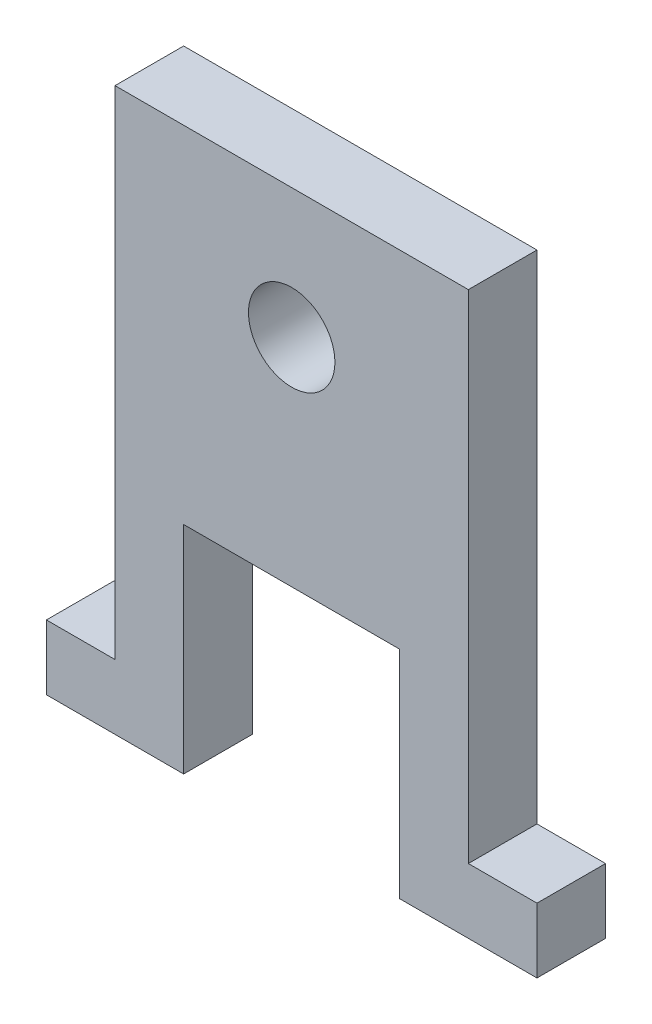
ISO-10303-21;
HEADER;
FILE_DESCRIPTION(('STEP AP214'),'2;1');
FILE_NAME('part.step','',(''),(''),'','','');
FILE_SCHEMA(('AUTOMOTIVE_DESIGN { 1 0 10303 214 1 1 1 1 }'));
ENDSEC;
DATA;
#1=APPLICATION_CONTEXT('core data for automotive mechanical design processes');
#2=APPLICATION_PROTOCOL_DEFINITION('international standard','automotive_design',2000,#1);
#3=PRODUCT_CONTEXT('',#1,'mechanical');
#4=PRODUCT('Part','Part','',(#3));
#5=PRODUCT_RELATED_PRODUCT_CATEGORY('part','',(#4));
#6=PRODUCT_DEFINITION_FORMATION('','',#4);
#7=PRODUCT_DEFINITION_CONTEXT('part definition',#1,'design');
#8=PRODUCT_DEFINITION('design','',#6,#7);
#9=PRODUCT_DEFINITION_SHAPE('','',#8);
#10=(LENGTH_UNIT() NAMED_UNIT(*) SI_UNIT(.MILLI.,.METRE.));
#11=(NAMED_UNIT(*) PLANE_ANGLE_UNIT() SI_UNIT($,.RADIAN.));
#12=(NAMED_UNIT(*) SI_UNIT($,.STERADIAN.) SOLID_ANGLE_UNIT());
#13=UNCERTAINTY_MEASURE_WITH_UNIT(LENGTH_MEASURE(1.E-05),#10,'distance_accuracy_value','');
#14=(GEOMETRIC_REPRESENTATION_CONTEXT(3) GLOBAL_UNCERTAINTY_ASSIGNED_CONTEXT((#13)) GLOBAL_UNIT_ASSIGNED_CONTEXT((#10,
#11,#12)) REPRESENTATION_CONTEXT('',''));
#15=CARTESIAN_POINT('',(0.,0.,0.));
#16=DIRECTION('',(0.,0.,1.));
#17=DIRECTION('',(1.,0.,0.));
#18=AXIS2_PLACEMENT_3D('',#15,#16,#17);
#19=CARTESIAN_POINT('',(0.,0.,6.35));
#20=DIRECTION('',(0.,0.,-1.));
#21=DIRECTION('',(-1.,0.,0.));
#22=AXIS2_PLACEMENT_3D('',#19,#20,#21);
#23=PLANE('',#22);
#24=DIRECTION('',(1.,0.,0.));
#25=VECTOR('',#24,1.);
#26=CARTESIAN_POINT('',(-10.,-8.2,6.35));
#27=LINE('',#26,#25);
#28=CARTESIAN_POINT('',(-22.7,-8.20000000000001,6.35));
#29=VERTEX_POINT('',#28);
#30=CARTESIAN_POINT('',(-10.,-8.2,6.35));
#31=VERTEX_POINT('',#30);
#32=EDGE_CURVE('E200',#29,#31,#27,.T.);
#33=ORIENTED_EDGE('',*,*,#32,.T.);
#34=DIRECTION('',(0.,1.,0.));
#35=VECTOR('',#34,1.);
#36=CARTESIAN_POINT('',(-10.,-8.2,6.35));
#37=LINE('',#36,#35);
#38=CARTESIAN_POINT('',(-10.,11.8,6.35));
#39=VERTEX_POINT('',#38);
#40=EDGE_CURVE('E112',#31,#39,#37,.T.);
#41=ORIENTED_EDGE('',*,*,#40,.T.);
#42=DIRECTION('',(1.,0.,0.));
#43=VECTOR('',#42,1.);
#44=CARTESIAN_POINT('',(-10.,11.8,6.35));
#45=LINE('',#44,#43);
#46=CARTESIAN_POINT('',(10.,11.8,6.35));
#47=VERTEX_POINT('',#46);
#48=EDGE_CURVE('E237',#39,#47,#45,.T.);
#49=ORIENTED_EDGE('',*,*,#48,.T.);
#50=DIRECTION('',(0.,-1.,0.));
#51=VECTOR('',#50,1.);
#52=CARTESIAN_POINT('',(10.,11.8,6.35));
#53=LINE('',#52,#51);
#54=CARTESIAN_POINT('',(10.,-8.2,6.35));
#55=VERTEX_POINT('',#54);
#56=EDGE_CURVE('E257',#47,#55,#53,.T.);
#57=ORIENTED_EDGE('',*,*,#56,.T.);
#58=DIRECTION('',(1.,0.,0.));
#59=VECTOR('',#58,1.);
#60=CARTESIAN_POINT('',(22.7,-8.2,6.35));
#61=LINE('',#60,#59);
#62=CARTESIAN_POINT('',(22.7,-8.2,6.35));
#63=VERTEX_POINT('',#62);
#64=EDGE_CURVE('E253',#55,#63,#61,.T.);
#65=ORIENTED_EDGE('',*,*,#64,.T.);
#66=DIRECTION('',(0.,1.,0.));
#67=VECTOR('',#66,1.);
#68=CARTESIAN_POINT('',(22.7,-2.19999999999999,6.35));
#69=LINE('',#68,#67);
#70=CARTESIAN_POINT('',(22.7,-2.19999999999999,6.35));
#71=VERTEX_POINT('',#70);
#72=EDGE_CURVE('E256',#63,#71,#69,.T.);
#73=ORIENTED_EDGE('',*,*,#72,.T.);
#74=DIRECTION('',(-1.,0.,0.));
#75=VECTOR('',#74,1.);
#76=CARTESIAN_POINT('',(16.35,-2.19999999999999,6.35));
#77=LINE('',#76,#75);
#78=CARTESIAN_POINT('',(16.35,-2.19999999999999,6.35));
#79=VERTEX_POINT('',#78);
#80=EDGE_CURVE('E261',#71,#79,#77,.T.);
#81=ORIENTED_EDGE('',*,*,#80,.T.);
#82=DIRECTION('',(0.,1.,0.));
#83=VECTOR('',#82,1.);
#84=CARTESIAN_POINT('',(16.35,43.8,6.35));
#85=LINE('',#84,#83);
#86=CARTESIAN_POINT('',(16.35,43.8,6.35));
#87=VERTEX_POINT('',#86);
#88=EDGE_CURVE('E268',#79,#87,#85,.T.);
#89=ORIENTED_EDGE('',*,*,#88,.T.);
#90=DIRECTION('',(-1.,0.,0.));
#91=VECTOR('',#90,1.);
#92=CARTESIAN_POINT('',(-16.35,43.8,6.35));
#93=LINE('',#92,#91);
#94=CARTESIAN_POINT('',(-16.35,43.8,6.35));
#95=VERTEX_POINT('',#94);
#96=EDGE_CURVE('E143',#87,#95,#93,.T.);
#97=ORIENTED_EDGE('',*,*,#96,.T.);
#98=DIRECTION('',(0.,-1.,0.));
#99=VECTOR('',#98,1.);
#100=CARTESIAN_POINT('',(-16.35,-2.2,6.35));
#101=LINE('',#100,#99);
#102=CARTESIAN_POINT('',(-16.35,-2.2,6.35));
#103=VERTEX_POINT('',#102);
#104=EDGE_CURVE('E137',#95,#103,#101,.T.);
#105=ORIENTED_EDGE('',*,*,#104,.T.);
#106=DIRECTION('',(-1.,0.,0.));
#107=VECTOR('',#106,1.);
#108=CARTESIAN_POINT('',(-22.7,-2.2,6.35));
#109=LINE('',#108,#107);
#110=CARTESIAN_POINT('',(-22.7,-2.2,6.35));
#111=VERTEX_POINT('',#110);
#112=EDGE_CURVE('E141',#103,#111,#109,.T.);
#113=ORIENTED_EDGE('',*,*,#112,.T.);
#114=DIRECTION('',(0.,-1.,0.));
#115=VECTOR('',#114,1.);
#116=CARTESIAN_POINT('',(-22.7,-8.20000000000001,6.35));
#117=LINE('',#116,#115);
#118=EDGE_CURVE('E57',#111,#29,#117,.T.);
#119=ORIENTED_EDGE('',*,*,#118,.T.);
#120=EDGE_LOOP('',(#33,#41,#49,#57,#65,#73,#81,#89,#97,#105,#113,#119));
#121=FACE_BOUND('',#120,.T.);
#122=CARTESIAN_POINT('',(0.,31.8,6.35));
#123=DIRECTION('',(0.,0.,1.));
#124=DIRECTION('',(1.,0.,0.));
#125=AXIS2_PLACEMENT_3D('',#122,#123,#124);
#126=CIRCLE('',#125,4.);
#127=CARTESIAN_POINT('',(4.,31.8,6.35));
#128=VERTEX_POINT('',#127);
#129=EDGE_CURVE('E170',#128,#128,#126,.T.);
#130=ORIENTED_EDGE('',*,*,#129,.F.);
#131=EDGE_LOOP('',(#130));
#132=FACE_BOUND('',#131,.T.);
#133=ADVANCED_FACE('F39',(#121,#132),#23,.F.);
#134=CARTESIAN_POINT('',(0.,0.,0.));
#135=DIRECTION('',(0.,0.,-1.));
#136=DIRECTION('',(-1.,0.,0.));
#137=AXIS2_PLACEMENT_3D('',#134,#135,#136);
#138=PLANE('',#137);
#139=DIRECTION('',(1.,0.,0.));
#140=VECTOR('',#139,1.);
#141=CARTESIAN_POINT('',(-10.,-8.2,0.));
#142=LINE('',#141,#140);
#143=CARTESIAN_POINT('',(-22.7,-8.20000000000001,0.));
#144=VERTEX_POINT('',#143);
#145=CARTESIAN_POINT('',(-10.,-8.2,0.));
#146=VERTEX_POINT('',#145);
#147=EDGE_CURVE('E165',#144,#146,#142,.T.);
#148=ORIENTED_EDGE('',*,*,#147,.F.);
#149=DIRECTION('',(0.,-1.,0.));
#150=VECTOR('',#149,1.);
#151=CARTESIAN_POINT('',(-22.7,-8.20000000000001,0.));
#152=LINE('',#151,#150);
#153=CARTESIAN_POINT('',(-22.7,-2.2,0.));
#154=VERTEX_POINT('',#153);
#155=EDGE_CURVE('E104',#154,#144,#152,.T.);
#156=ORIENTED_EDGE('',*,*,#155,.F.);
#157=DIRECTION('',(-1.,0.,0.));
#158=VECTOR('',#157,1.);
#159=CARTESIAN_POINT('',(-22.7,-2.2,0.));
#160=LINE('',#159,#158);
#161=CARTESIAN_POINT('',(-16.35,-2.2,0.));
#162=VERTEX_POINT('',#161);
#163=EDGE_CURVE('E98',#162,#154,#160,.T.);
#164=ORIENTED_EDGE('',*,*,#163,.F.);
#165=DIRECTION('',(0.,-1.,0.));
#166=VECTOR('',#165,1.);
#167=CARTESIAN_POINT('',(-16.35,-2.2,0.));
#168=LINE('',#167,#166);
#169=CARTESIAN_POINT('',(-16.35,43.8,0.));
#170=VERTEX_POINT('',#169);
#171=EDGE_CURVE('E152',#170,#162,#168,.T.);
#172=ORIENTED_EDGE('',*,*,#171,.F.);
#173=DIRECTION('',(-1.,0.,0.));
#174=VECTOR('',#173,1.);
#175=CARTESIAN_POINT('',(-16.35,43.8,0.));
#176=LINE('',#175,#174);
#177=CARTESIAN_POINT('',(16.35,43.8,0.));
#178=VERTEX_POINT('',#177);
#179=EDGE_CURVE('E191',#178,#170,#176,.T.);
#180=ORIENTED_EDGE('',*,*,#179,.F.);
#181=DIRECTION('',(0.,1.,0.));
#182=VECTOR('',#181,1.);
#183=CARTESIAN_POINT('',(16.35,43.8,0.));
#184=LINE('',#183,#182);
#185=CARTESIAN_POINT('',(16.35,-2.19999999999999,0.));
#186=VERTEX_POINT('',#185);
#187=EDGE_CURVE('E188',#186,#178,#184,.T.);
#188=ORIENTED_EDGE('',*,*,#187,.F.);
#189=DIRECTION('',(-1.,0.,0.));
#190=VECTOR('',#189,1.);
#191=CARTESIAN_POINT('',(16.35,-2.19999999999999,0.));
#192=LINE('',#191,#190);
#193=CARTESIAN_POINT('',(22.7,-2.19999999999999,0.));
#194=VERTEX_POINT('',#193);
#195=EDGE_CURVE('E185',#194,#186,#192,.T.);
#196=ORIENTED_EDGE('',*,*,#195,.F.);
#197=DIRECTION('',(0.,1.,0.));
#198=VECTOR('',#197,1.);
#199=CARTESIAN_POINT('',(22.7,-2.19999999999999,0.));
#200=LINE('',#199,#198);
#201=CARTESIAN_POINT('',(22.7,-8.2,0.));
#202=VERTEX_POINT('',#201);
#203=EDGE_CURVE('E182',#202,#194,#200,.T.);
#204=ORIENTED_EDGE('',*,*,#203,.F.);
#205=DIRECTION('',(1.,0.,0.));
#206=VECTOR('',#205,1.);
#207=CARTESIAN_POINT('',(22.7,-8.2,0.));
#208=LINE('',#207,#206);
#209=CARTESIAN_POINT('',(10.,-8.2,0.));
#210=VERTEX_POINT('',#209);
#211=EDGE_CURVE('E179',#210,#202,#208,.T.);
#212=ORIENTED_EDGE('',*,*,#211,.F.);
#213=DIRECTION('',(0.,-1.,0.));
#214=VECTOR('',#213,1.);
#215=CARTESIAN_POINT('',(10.,11.8,0.));
#216=LINE('',#215,#214);
#217=CARTESIAN_POINT('',(10.,11.8,0.));
#218=VERTEX_POINT('',#217);
#219=EDGE_CURVE('E176',#218,#210,#216,.T.);
#220=ORIENTED_EDGE('',*,*,#219,.F.);
#221=DIRECTION('',(1.,0.,0.));
#222=VECTOR('',#221,1.);
#223=CARTESIAN_POINT('',(-10.,11.8,0.));
#224=LINE('',#223,#222);
#225=CARTESIAN_POINT('',(-10.,11.8,0.));
#226=VERTEX_POINT('',#225);
#227=EDGE_CURVE('E173',#226,#218,#224,.T.);
#228=ORIENTED_EDGE('',*,*,#227,.F.);
#229=DIRECTION('',(0.,1.,0.));
#230=VECTOR('',#229,1.);
#231=CARTESIAN_POINT('',(-10.,-8.2,0.));
#232=LINE('',#231,#230);
#233=EDGE_CURVE('E169',#146,#226,#232,.T.);
#234=ORIENTED_EDGE('',*,*,#233,.F.);
#235=EDGE_LOOP('',(#148,#156,#164,#172,#180,#188,#196,#204,#212,#220,#228,#234));
#236=FACE_BOUND('',#235,.T.);
#237=CARTESIAN_POINT('',(0.,31.8,0.));
#238=DIRECTION('',(0.,0.,1.));
#239=DIRECTION('',(1.,0.,0.));
#240=AXIS2_PLACEMENT_3D('',#237,#238,#239);
#241=CIRCLE('',#240,4.);
#242=CARTESIAN_POINT('',(4.,31.8,0.));
#243=VERTEX_POINT('',#242);
#244=EDGE_CURVE('E417',#243,#243,#241,.T.);
#245=ORIENTED_EDGE('',*,*,#244,.T.);
#246=EDGE_LOOP('',(#245));
#247=FACE_BOUND('',#246,.T.);
#248=ADVANCED_FACE('F241',(#236,#247),#138,.T.);
#249=CARTESIAN_POINT('',(-10.,-8.2,6.35));
#250=DIRECTION('',(0.,1.,0.));
#251=DIRECTION('',(-1.,0.,0.));
#252=AXIS2_PLACEMENT_3D('',#249,#250,#251);
#253=PLANE('',#252);
#254=ORIENTED_EDGE('',*,*,#147,.T.);
#255=DIRECTION('',(0.,0.,-1.));
#256=VECTOR('',#255,1.);
#257=CARTESIAN_POINT('',(-10.,-8.2,6.35));
#258=LINE('',#257,#256);
#259=EDGE_CURVE('E11',#31,#146,#258,.T.);
#260=ORIENTED_EDGE('',*,*,#259,.F.);
#261=ORIENTED_EDGE('',*,*,#32,.F.);
#262=DIRECTION('',(0.,0.,-1.));
#263=VECTOR('',#262,1.);
#264=CARTESIAN_POINT('',(-22.7,-8.20000000000001,6.35));
#265=LINE('',#264,#263);
#266=EDGE_CURVE('E161',#29,#144,#265,.T.);
#267=ORIENTED_EDGE('',*,*,#266,.T.);
#268=EDGE_LOOP('',(#254,#260,#261,#267));
#269=FACE_BOUND('',#268,.T.);
#270=ADVANCED_FACE('F41',(#269),#253,.F.);
#271=CARTESIAN_POINT('',(-10.,-8.2,6.35));
#272=DIRECTION('',(-1.,0.,0.));
#273=DIRECTION('',(0.,-1.,0.));
#274=AXIS2_PLACEMENT_3D('',#271,#272,#273);
#275=PLANE('',#274);
#276=ORIENTED_EDGE('',*,*,#233,.T.);
#277=DIRECTION('',(0.,0.,-1.));
#278=VECTOR('',#277,1.);
#279=CARTESIAN_POINT('',(-10.,11.8,6.35));
#280=LINE('',#279,#278);
#281=EDGE_CURVE('E49',#39,#226,#280,.T.);
#282=ORIENTED_EDGE('',*,*,#281,.F.);
#283=ORIENTED_EDGE('',*,*,#40,.F.);
#284=ORIENTED_EDGE('',*,*,#259,.T.);
#285=EDGE_LOOP('',(#276,#282,#283,#284));
#286=FACE_BOUND('',#285,.T.);
#287=ADVANCED_FACE('F304',(#286),#275,.F.);
#288=CARTESIAN_POINT('',(-10.,11.8,6.35));
#289=DIRECTION('',(0.,1.,0.));
#290=DIRECTION('',(0.,0.,1.));
#291=AXIS2_PLACEMENT_3D('',#288,#289,#290);
#292=PLANE('',#291);
#293=ORIENTED_EDGE('',*,*,#227,.T.);
#294=DIRECTION('',(0.,0.,-1.));
#295=VECTOR('',#294,1.);
#296=CARTESIAN_POINT('',(10.,11.8,6.35));
#297=LINE('',#296,#295);
#298=EDGE_CURVE('E227',#47,#218,#297,.T.);
#299=ORIENTED_EDGE('',*,*,#298,.F.);
#300=ORIENTED_EDGE('',*,*,#48,.F.);
#301=ORIENTED_EDGE('',*,*,#281,.T.);
#302=EDGE_LOOP('',(#293,#299,#300,#301));
#303=FACE_BOUND('',#302,.T.);
#304=ADVANCED_FACE('F235',(#303),#292,.F.);
#305=CARTESIAN_POINT('',(10.,11.8,6.35));
#306=DIRECTION('',(1.,0.,0.));
#307=DIRECTION('',(0.,1.,0.));
#308=AXIS2_PLACEMENT_3D('',#305,#306,#307);
#309=PLANE('',#308);
#310=ORIENTED_EDGE('',*,*,#219,.T.);
#311=DIRECTION('',(0.,0.,-1.));
#312=VECTOR('',#311,1.);
#313=CARTESIAN_POINT('',(10.,-8.2,6.35));
#314=LINE('',#313,#312);
#315=EDGE_CURVE('E223',#55,#210,#314,.T.);
#316=ORIENTED_EDGE('',*,*,#315,.F.);
#317=ORIENTED_EDGE('',*,*,#56,.F.);
#318=ORIENTED_EDGE('',*,*,#298,.T.);
#319=EDGE_LOOP('',(#310,#316,#317,#318));
#320=FACE_BOUND('',#319,.T.);
#321=ADVANCED_FACE('F247',(#320),#309,.F.);
#322=CARTESIAN_POINT('',(22.7,-8.2,6.35));
#323=DIRECTION('',(0.,1.,0.));
#324=DIRECTION('',(-1.,0.,0.));
#325=AXIS2_PLACEMENT_3D('',#322,#323,#324);
#326=PLANE('',#325);
#327=ORIENTED_EDGE('',*,*,#211,.T.);
#328=DIRECTION('',(0.,0.,-1.));
#329=VECTOR('',#328,1.);
#330=CARTESIAN_POINT('',(22.7,-8.2,6.35));
#331=LINE('',#330,#329);
#332=EDGE_CURVE('E219',#63,#202,#331,.T.);
#333=ORIENTED_EDGE('',*,*,#332,.F.);
#334=ORIENTED_EDGE('',*,*,#64,.F.);
#335=ORIENTED_EDGE('',*,*,#315,.T.);
#336=EDGE_LOOP('',(#327,#333,#334,#335));
#337=FACE_BOUND('',#336,.T.);
#338=ADVANCED_FACE('F251',(#337),#326,.F.);
#339=CARTESIAN_POINT('',(22.7,-2.19999999999999,6.35));
#340=DIRECTION('',(-1.,0.,0.));
#341=DIRECTION('',(0.,-1.,0.));
#342=AXIS2_PLACEMENT_3D('',#339,#340,#341);
#343=PLANE('',#342);
#344=ORIENTED_EDGE('',*,*,#203,.T.);
#345=DIRECTION('',(0.,0.,-1.));
#346=VECTOR('',#345,1.);
#347=CARTESIAN_POINT('',(22.7,-2.19999999999999,6.35));
#348=LINE('',#347,#346);
#349=EDGE_CURVE('E215',#71,#194,#348,.T.);
#350=ORIENTED_EDGE('',*,*,#349,.F.);
#351=ORIENTED_EDGE('',*,*,#72,.F.);
#352=ORIENTED_EDGE('',*,*,#332,.T.);
#353=EDGE_LOOP('',(#344,#350,#351,#352));
#354=FACE_BOUND('',#353,.T.);
#355=ADVANCED_FACE('F317',(#354),#343,.F.);
#356=CARTESIAN_POINT('',(16.35,-2.19999999999999,6.35));
#357=DIRECTION('',(0.,-1.,0.));
#358=DIRECTION('',(0.,0.,-1.));
#359=AXIS2_PLACEMENT_3D('',#356,#357,#358);
#360=PLANE('',#359);
#361=ORIENTED_EDGE('',*,*,#195,.T.);
#362=DIRECTION('',(0.,0.,-1.));
#363=VECTOR('',#362,1.);
#364=CARTESIAN_POINT('',(16.35,-2.19999999999999,6.35));
#365=LINE('',#364,#363);
#366=EDGE_CURVE('E211',#79,#186,#365,.T.);
#367=ORIENTED_EDGE('',*,*,#366,.F.);
#368=ORIENTED_EDGE('',*,*,#80,.F.);
#369=ORIENTED_EDGE('',*,*,#349,.T.);
#370=EDGE_LOOP('',(#361,#367,#368,#369));
#371=FACE_BOUND('',#370,.T.);
#372=ADVANCED_FACE('F320',(#371),#360,.F.);
#373=CARTESIAN_POINT('',(16.35,43.8,6.35));
#374=DIRECTION('',(-1.,0.,0.));
#375=DIRECTION('',(0.,-1.,0.));
#376=AXIS2_PLACEMENT_3D('',#373,#374,#375);
#377=PLANE('',#376);
#378=ORIENTED_EDGE('',*,*,#187,.T.);
#379=DIRECTION('',(0.,0.,-1.));
#380=VECTOR('',#379,1.);
#381=CARTESIAN_POINT('',(16.35,43.8,6.35));
#382=LINE('',#381,#380);
#383=EDGE_CURVE('E207',#87,#178,#382,.T.);
#384=ORIENTED_EDGE('',*,*,#383,.F.);
#385=ORIENTED_EDGE('',*,*,#88,.F.);
#386=ORIENTED_EDGE('',*,*,#366,.T.);
#387=EDGE_LOOP('',(#378,#384,#385,#386));
#388=FACE_BOUND('',#387,.T.);
#389=ADVANCED_FACE('F276',(#388),#377,.F.);
#390=CARTESIAN_POINT('',(-16.35,43.8,6.35));
#391=DIRECTION('',(0.,-1.,0.));
#392=DIRECTION('',(1.,0.,0.));
#393=AXIS2_PLACEMENT_3D('',#390,#391,#392);
#394=PLANE('',#393);
#395=ORIENTED_EDGE('',*,*,#179,.T.);
#396=DIRECTION('',(0.,0.,-1.));
#397=VECTOR('',#396,1.);
#398=CARTESIAN_POINT('',(-16.35,43.8,6.35));
#399=LINE('',#398,#397);
#400=EDGE_CURVE('E154',#95,#170,#399,.T.);
#401=ORIENTED_EDGE('',*,*,#400,.F.);
#402=ORIENTED_EDGE('',*,*,#96,.F.);
#403=ORIENTED_EDGE('',*,*,#383,.T.);
#404=EDGE_LOOP('',(#395,#401,#402,#403));
#405=FACE_BOUND('',#404,.T.);
#406=ADVANCED_FACE('F280',(#405),#394,.F.);
#407=CARTESIAN_POINT('',(-16.35,-2.2,6.35));
#408=DIRECTION('',(1.,0.,0.));
#409=DIRECTION('',(0.,0.,-1.));
#410=AXIS2_PLACEMENT_3D('',#407,#408,#409);
#411=PLANE('',#410);
#412=ORIENTED_EDGE('',*,*,#171,.T.);
#413=DIRECTION('',(0.,0.,-1.));
#414=VECTOR('',#413,1.);
#415=CARTESIAN_POINT('',(-16.35,-2.2,6.35));
#416=LINE('',#415,#414);
#417=EDGE_CURVE('E149',#103,#162,#416,.T.);
#418=ORIENTED_EDGE('',*,*,#417,.F.);
#419=ORIENTED_EDGE('',*,*,#104,.F.);
#420=ORIENTED_EDGE('',*,*,#400,.T.);
#421=EDGE_LOOP('',(#412,#418,#419,#420));
#422=FACE_BOUND('',#421,.T.);
#423=ADVANCED_FACE('F150',(#422),#411,.F.);
#424=CARTESIAN_POINT('',(-22.7,-2.2,6.35));
#425=DIRECTION('',(0.,-1.,0.));
#426=DIRECTION('',(0.,0.,-1.));
#427=AXIS2_PLACEMENT_3D('',#424,#425,#426);
#428=PLANE('',#427);
#429=ORIENTED_EDGE('',*,*,#163,.T.);
#430=DIRECTION('',(0.,0.,-1.));
#431=VECTOR('',#430,1.);
#432=CARTESIAN_POINT('',(-22.7,-2.2,6.35));
#433=LINE('',#432,#431);
#434=EDGE_CURVE('E155',#111,#154,#433,.T.);
#435=ORIENTED_EDGE('',*,*,#434,.F.);
#436=ORIENTED_EDGE('',*,*,#112,.F.);
#437=ORIENTED_EDGE('',*,*,#417,.T.);
#438=EDGE_LOOP('',(#429,#435,#436,#437));
#439=FACE_BOUND('',#438,.T.);
#440=ADVANCED_FACE('F157',(#439),#428,.F.);
#441=CARTESIAN_POINT('',(-22.7,-8.20000000000001,6.35));
#442=DIRECTION('',(1.,0.,0.));
#443=DIRECTION('',(0.,0.,-1.));
#444=AXIS2_PLACEMENT_3D('',#441,#442,#443);
#445=PLANE('',#444);
#446=ORIENTED_EDGE('',*,*,#155,.T.);
#447=ORIENTED_EDGE('',*,*,#266,.F.);
#448=ORIENTED_EDGE('',*,*,#118,.F.);
#449=ORIENTED_EDGE('',*,*,#434,.T.);
#450=EDGE_LOOP('',(#446,#447,#448,#449));
#451=FACE_BOUND('',#450,.T.);
#452=ADVANCED_FACE('F284',(#451),#445,.F.);
#453=CARTESIAN_POINT('',(0.,31.8,6.35));
#454=DIRECTION('',(0.,0.,-1.));
#455=DIRECTION('',(-1.,0.,0.));
#456=AXIS2_PLACEMENT_3D('',#453,#454,#455);
#457=CYLINDRICAL_SURFACE('',#456,4.);
#458=ORIENTED_EDGE('',*,*,#129,.T.);
#459=EDGE_LOOP('',(#458));
#460=FACE_BOUND('',#459,.T.);
#461=ORIENTED_EDGE('',*,*,#244,.F.);
#462=EDGE_LOOP('',(#461));
#463=FACE_BOUND('',#462,.T.);
#464=ADVANCED_FACE('F286',(#460,#463),#457,.F.);
#465=CLOSED_SHELL('',(#133,#248,#270,#287,#304,#321,#338,#355,#372,#389,#406,#423,#440,#452,#464));
#466=MANIFOLD_SOLID_BREP('B2',#465);
#467=ADVANCED_BREP_SHAPE_REPRESENTATION('',(#18,#466),#14);
#468=SHAPE_DEFINITION_REPRESENTATION(#9,#467);
ENDSEC;
END-ISO-10303-21;
